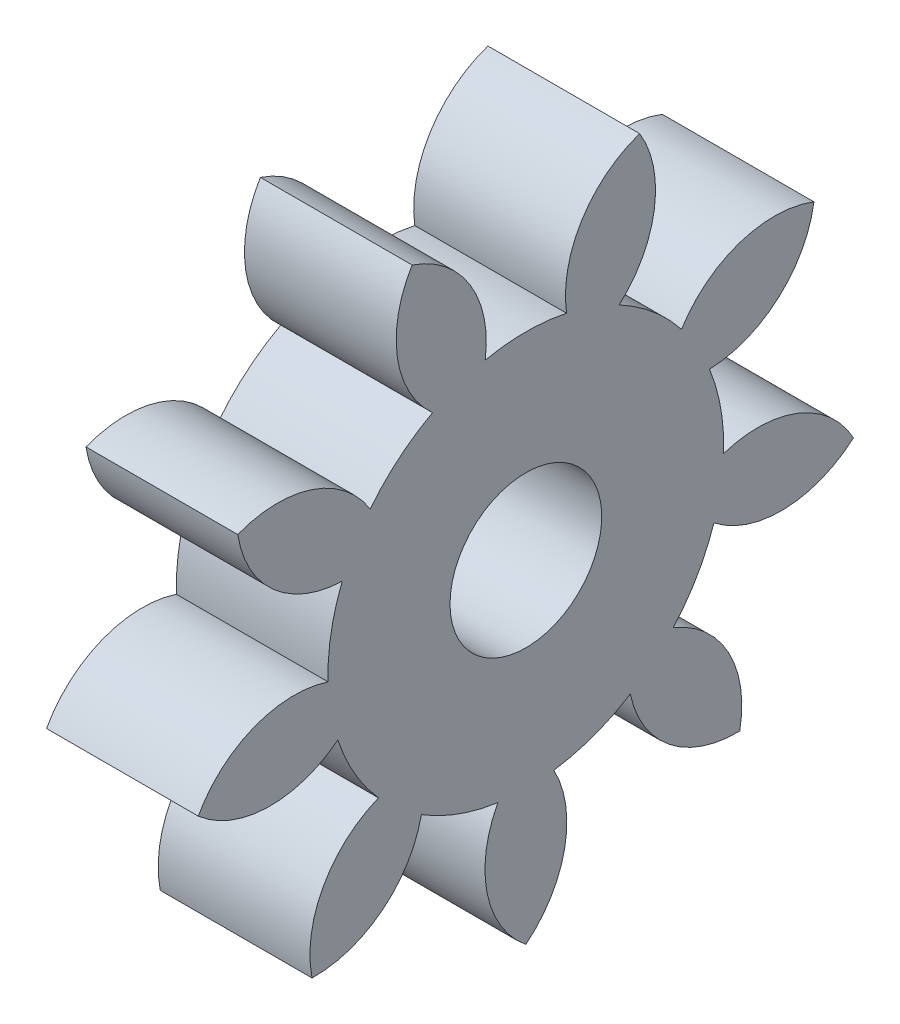
ISO-10303-21;
HEADER;
FILE_DESCRIPTION(('STEP AP214'),'2;1');
FILE_NAME('part.step','',(''),(''),'','','');
FILE_SCHEMA(('AUTOMOTIVE_DESIGN { 1 0 10303 214 1 1 1 1 }'));
ENDSEC;
DATA;
#1=APPLICATION_CONTEXT('core data for automotive mechanical design processes');
#2=APPLICATION_PROTOCOL_DEFINITION('international standard','automotive_design',2000,#1);
#3=PRODUCT_CONTEXT('',#1,'mechanical');
#4=PRODUCT('Part','Part','',(#3));
#5=PRODUCT_RELATED_PRODUCT_CATEGORY('part','',(#4));
#6=PRODUCT_DEFINITION_FORMATION('','',#4);
#7=PRODUCT_DEFINITION_CONTEXT('part definition',#1,'design');
#8=PRODUCT_DEFINITION('design','',#6,#7);
#9=PRODUCT_DEFINITION_SHAPE('','',#8);
#10=(LENGTH_UNIT() NAMED_UNIT(*) SI_UNIT(.MILLI.,.METRE.));
#11=(NAMED_UNIT(*) PLANE_ANGLE_UNIT() SI_UNIT($,.RADIAN.));
#12=(NAMED_UNIT(*) SI_UNIT($,.STERADIAN.) SOLID_ANGLE_UNIT());
#13=UNCERTAINTY_MEASURE_WITH_UNIT(LENGTH_MEASURE(1.E-05),#10,'distance_accuracy_value','');
#14=(GEOMETRIC_REPRESENTATION_CONTEXT(3) GLOBAL_UNCERTAINTY_ASSIGNED_CONTEXT((#13)) GLOBAL_UNIT_ASSIGNED_CONTEXT((#10,
#11,#12)) REPRESENTATION_CONTEXT('',''));
#15=CARTESIAN_POINT('',(0.,0.,0.));
#16=DIRECTION('',(0.,0.,1.));
#17=DIRECTION('',(1.,0.,0.));
#18=AXIS2_PLACEMENT_3D('',#15,#16,#17);
#19=CARTESIAN_POINT('',(3.175,0.,0.));
#20=DIRECTION('',(-1.,0.,0.));
#21=DIRECTION('',(0.,0.,1.));
#22=AXIS2_PLACEMENT_3D('',#19,#20,#21);
#23=PLANE('',#22);
#24=CARTESIAN_POINT('',(3.175,5.35333295209364,0.427099251646094));
#25=DIRECTION('',(-1.,0.,0.));
#26=DIRECTION('',(0.,0.642787609686541,-0.766044443118977));
#27=AXIS2_PLACEMENT_3D('',#24,#25,#26);
#28=CIRCLE('',#27,2.286);
#29=CARTESIAN_POINT('',(3.175,3.65082029361267,1.95263084676698));
#30=VERTEX_POINT('',#29);
#31=CARTESIAN_POINT('',(3.175,6.54062407727787,2.380592477654));
#32=VERTEX_POINT('',#31);
#33=EDGE_CURVE('E50',#30,#32,#28,.T.);
#34=ORIENTED_EDGE('',*,*,#33,.F.);
#35=CARTESIAN_POINT('',(3.175,0.,0.));
#36=DIRECTION('',(-1.,0.,0.));
#37=DIRECTION('',(0.,0.642787609686541,-0.766044443118977));
#38=AXIS2_PLACEMENT_3D('',#35,#36,#37);
#39=CIRCLE('',#38,4.1402);
#40=CARTESIAN_POINT('',(3.175,2.55692428764219,3.25628534180675));
#41=VERTEX_POINT('',#40);
#42=EDGE_CURVE('E273',#41,#30,#39,.T.);
#43=ORIENTED_EDGE('',*,*,#42,.F.);
#44=CARTESIAN_POINT('',(3.175,1.35020716590216,5.19783878894629));
#45=DIRECTION('',(-1.,0.,0.));
#46=DIRECTION('',(0.,0.642787609686541,-0.766044443118977));
#47=AXIS2_PLACEMENT_3D('',#44,#45,#46);
#48=CIRCLE('',#47,2.286);
#49=CARTESIAN_POINT('',(3.175,3.48019338057993,6.02787175532935));
#50=VERTEX_POINT('',#49);
#51=EDGE_CURVE('E429',#50,#41,#48,.T.);
#52=ORIENTED_EDGE('',*,*,#51,.F.);
#53=CARTESIAN_POINT('',(3.175,3.82635685305253,3.76823310051622));
#54=DIRECTION('',(-1.,0.,0.));
#55=DIRECTION('',(0.,0.984807753012209,-0.173648177666927));
#56=AXIS2_PLACEMENT_3D('',#53,#54,#55);
#57=CIRCLE('',#56,2.286);
#58=CARTESIAN_POINT('',(3.175,1.54156368415443,3.84250405955495));
#59=VERTEX_POINT('',#58);
#60=EDGE_CURVE('E409',#59,#50,#57,.T.);
#61=ORIENTED_EDGE('',*,*,#60,.F.);
#62=CARTESIAN_POINT('',(3.175,0.,0.));
#63=DIRECTION('',(-1.,0.,0.));
#64=DIRECTION('',(0.,0.984807753012209,-0.173648177666927));
#65=AXIS2_PLACEMENT_3D('',#62,#63,#64);
#66=CIRCLE('',#65,4.1402);
#67=CARTESIAN_POINT('',(3.175,-0.13438222929303,4.13801854230382));
#68=VERTEX_POINT('',#67);
#69=EDGE_CURVE('E415',#68,#59,#66,.T.);
#70=ORIENTED_EDGE('',*,*,#69,.F.);
#71=CARTESIAN_POINT('',(3.175,-2.306787674184,4.84967195725247));
#72=DIRECTION('',(-1.,0.,0.));
#73=DIRECTION('',(0.,0.984807753012209,-0.173648177666927));
#74=AXIS2_PLACEMENT_3D('',#71,#72,#73);
#75=CIRCLE('',#74,2.286);
#76=CARTESIAN_POINT('',(3.175,-1.20865847693247,6.85464284635378));
#77=VERTEX_POINT('',#76);
#78=EDGE_CURVE('E412',#77,#68,#75,.T.);
#79=ORIENTED_EDGE('',*,*,#78,.F.);
#80=CARTESIAN_POINT('',(3.175,0.508985857248586,5.3461688024088));
#81=DIRECTION('',(-1.,0.,0.));
#82=DIRECTION('',(0.,0.866025403784436,0.500000000000004));
#83=AXIS2_PLACEMENT_3D('',#80,#81,#82);
#84=CIRCLE('',#83,2.286);
#85=CARTESIAN_POINT('',(3.175,-1.28900770569164,3.93442691820138));
#86=VERTEX_POINT('',#85);
#87=EDGE_CURVE('E387',#86,#77,#84,.T.);
#88=ORIENTED_EDGE('',*,*,#87,.F.);
#89=CARTESIAN_POINT('',(3.175,0.,0.));
#90=DIRECTION('',(-1.,0.,0.));
#91=DIRECTION('',(0.,0.866025403784436,0.500000000000004));
#92=AXIS2_PLACEMENT_3D('',#89,#90,#91);
#93=CIRCLE('',#92,4.1402);
#94=CARTESIAN_POINT('',(3.175,-2.76280980764992,3.08352687790352));
#95=VERTEX_POINT('',#94);
#96=EDGE_CURVE('E393',#95,#86,#93,.T.);
#97=ORIENTED_EDGE('',*,*,#96,.F.);
#98=CARTESIAN_POINT('',(3.175,-4.88441092443016,2.23228971866008));
#99=DIRECTION('',(-1.,0.,0.));
#100=DIRECTION('',(0.,0.866025403784436,0.500000000000004));
#101=AXIS2_PLACEMENT_3D('',#98,#99,#100);
#102=CIRCLE('',#101,2.286);
#103=CARTESIAN_POINT('',(3.175,-5.33196560034545,4.47405036869977));
#104=VERTEX_POINT('',#103);
#105=EDGE_CURVE('E390',#104,#95,#102,.T.);
#106=ORIENTED_EDGE('',*,*,#105,.F.);
#107=CARTESIAN_POINT('',(3.175,-3.04654527790968,4.42257270560637));
#108=DIRECTION('',(-1.,0.,0.));
#109=DIRECTION('',(0.,0.342020143325663,0.939692620785911));
#110=AXIS2_PLACEMENT_3D('',#107,#108,#109);
#111=CIRCLE('',#110,2.286);
#112=CARTESIAN_POINT('',(3.175,-3.51643806431967,2.18538769553683));
#113=VERTEX_POINT('',#112);
#114=EDGE_CURVE('E365',#113,#104,#111,.T.);
#115=ORIENTED_EDGE('',*,*,#114,.F.);
#116=CARTESIAN_POINT('',(3.175,0.,0.));
#117=DIRECTION('',(-1.,0.,0.));
#118=DIRECTION('',(0.,0.342020143325663,0.939692620785911));
#119=AXIS2_PLACEMENT_3D('',#116,#117,#118);
#120=CIRCLE('',#119,4.1402);
#121=CARTESIAN_POINT('',(3.175,-4.09848797179663,0.586218717748173));
#122=VERTEX_POINT('',#121);
#123=EDGE_CURVE('E371',#122,#113,#120,.T.);
#124=ORIENTED_EDGE('',*,*,#123,.F.);
#125=CARTESIAN_POINT('',(3.175,-5.1765640189547,-1.42960568843011));
#126=DIRECTION('',(-1.,0.,0.));
#127=DIRECTION('',(0.,0.342020143325663,0.939692620785911));
#128=AXIS2_PLACEMENT_3D('',#125,#126,#127);
#129=CIRCLE('',#128,2.286);
#130=CARTESIAN_POINT('',(3.175,-6.96038676115988,0.));
#131=VERTEX_POINT('',#130);
#132=EDGE_CURVE('E368',#131,#122,#129,.T.);
#133=ORIENTED_EDGE('',*,*,#132,.F.);
#134=CARTESIAN_POINT('',(3.175,-5.17656401895472,1.42960568843004));
#135=DIRECTION('',(-1.,0.,0.));
#136=DIRECTION('',(0.,-0.342020143325676,0.939692620785906));
#137=AXIS2_PLACEMENT_3D('',#134,#135,#136);
#138=CIRCLE('',#137,2.286);
#139=CARTESIAN_POINT('',(3.175,-4.09848797179663,-0.586218717748228));
#140=VERTEX_POINT('',#139);
#141=EDGE_CURVE('E343',#140,#131,#138,.T.);
#142=ORIENTED_EDGE('',*,*,#141,.F.);
#143=CARTESIAN_POINT('',(3.175,0.,0.));
#144=DIRECTION('',(-1.,0.,0.));
#145=DIRECTION('',(0.,-0.342020143325676,0.939692620785906));
#146=AXIS2_PLACEMENT_3D('',#143,#144,#145);
#147=CIRCLE('',#146,4.1402);
#148=CARTESIAN_POINT('',(3.175,-3.51643806431964,-2.18538769553688));
#149=VERTEX_POINT('',#148);
#150=EDGE_CURVE('E349',#149,#140,#147,.T.);
#151=ORIENTED_EDGE('',*,*,#150,.F.);
#152=CARTESIAN_POINT('',(3.175,-3.04654527790962,-4.42257270560641));
#153=DIRECTION('',(-1.,0.,0.));
#154=DIRECTION('',(0.,-0.342020143325676,0.939692620785906));
#155=AXIS2_PLACEMENT_3D('',#152,#153,#154);
#156=CIRCLE('',#155,2.286);
#157=CARTESIAN_POINT('',(3.175,-5.33196560034539,-4.47405036869984));
#158=VERTEX_POINT('',#157);
#159=EDGE_CURVE('E346',#158,#149,#156,.T.);
#160=ORIENTED_EDGE('',*,*,#159,.F.);
#161=CARTESIAN_POINT('',(3.175,-4.88441092443013,-2.23228971866015));
#162=DIRECTION('',(-1.,0.,0.));
#163=DIRECTION('',(0.,-0.866025403784443,0.499999999999992));
#164=AXIS2_PLACEMENT_3D('',#161,#162,#163);
#165=CIRCLE('',#164,2.286);
#166=CARTESIAN_POINT('',(3.175,-2.76280980764988,-3.08352687790355));
#167=VERTEX_POINT('',#166);
#168=EDGE_CURVE('E321',#167,#158,#165,.T.);
#169=ORIENTED_EDGE('',*,*,#168,.F.);
#170=CARTESIAN_POINT('',(3.175,0.,0.));
#171=DIRECTION('',(-1.,0.,0.));
#172=DIRECTION('',(0.,-0.866025403784443,0.499999999999992));
#173=AXIS2_PLACEMENT_3D('',#170,#171,#172);
#174=CIRCLE('',#173,4.1402);
#175=CARTESIAN_POINT('',(3.175,-1.28900770569158,-3.93442691820139));
#176=VERTEX_POINT('',#175);
#177=EDGE_CURVE('E327',#176,#167,#174,.T.);
#178=ORIENTED_EDGE('',*,*,#177,.F.);
#179=CARTESIAN_POINT('',(3.175,0.508985857248661,-5.34616880240879));
#180=DIRECTION('',(-1.,0.,0.));
#181=DIRECTION('',(0.,-0.866025403784443,0.499999999999992));
#182=AXIS2_PLACEMENT_3D('',#179,#180,#181);
#183=CIRCLE('',#182,2.286);
#184=CARTESIAN_POINT('',(3.175,-1.20865847693237,-6.85464284635379));
#185=VERTEX_POINT('',#184);
#186=EDGE_CURVE('E324',#185,#176,#183,.T.);
#187=ORIENTED_EDGE('',*,*,#186,.F.);
#188=CARTESIAN_POINT('',(3.175,-2.30678767418394,-4.8496719572525));
#189=DIRECTION('',(-1.,0.,0.));
#190=DIRECTION('',(0.,-0.984807753012206,-0.17364817766694));
#191=AXIS2_PLACEMENT_3D('',#188,#189,#190);
#192=CIRCLE('',#191,2.286);
#193=CARTESIAN_POINT('',(3.175,-0.134382229292976,-4.13801854230382));
#194=VERTEX_POINT('',#193);
#195=EDGE_CURVE('E299',#194,#185,#192,.T.);
#196=ORIENTED_EDGE('',*,*,#195,.F.);
#197=CARTESIAN_POINT('',(3.175,0.,0.));
#198=DIRECTION('',(-1.,0.,0.));
#199=DIRECTION('',(0.,-0.984807753012206,-0.17364817766694));
#200=AXIS2_PLACEMENT_3D('',#197,#198,#199);
#201=CIRCLE('',#200,4.1402);
#202=CARTESIAN_POINT('',(3.175,1.54156368415448,-3.84250405955492));
#203=VERTEX_POINT('',#202);
#204=EDGE_CURVE('E305',#203,#194,#201,.T.);
#205=ORIENTED_EDGE('',*,*,#204,.F.);
#206=CARTESIAN_POINT('',(3.175,3.82635685305259,-3.76823310051617));
#207=DIRECTION('',(-1.,0.,0.));
#208=DIRECTION('',(0.,-0.984807753012206,-0.17364817766694));
#209=AXIS2_PLACEMENT_3D('',#206,#207,#208);
#210=CIRCLE('',#209,2.286);
#211=CARTESIAN_POINT('',(3.175,3.48019338058001,-6.02787175532931));
#212=VERTEX_POINT('',#211);
#213=EDGE_CURVE('E302',#212,#203,#210,.T.);
#214=ORIENTED_EDGE('',*,*,#213,.F.);
#215=CARTESIAN_POINT('',(3.175,1.35020716590223,-5.19783878894628));
#216=DIRECTION('',(-1.,0.,0.));
#217=DIRECTION('',(0.,-0.64278760968653,-0.766044443118986));
#218=AXIS2_PLACEMENT_3D('',#215,#216,#217);
#219=CIRCLE('',#218,2.286);
#220=CARTESIAN_POINT('',(3.175,2.55692428764223,-3.25628534180671));
#221=VERTEX_POINT('',#220);
#222=EDGE_CURVE('E284',#221,#212,#219,.T.);
#223=ORIENTED_EDGE('',*,*,#222,.F.);
#224=CARTESIAN_POINT('',(3.175,0.,0.));
#225=DIRECTION('',(-1.,0.,0.));
#226=DIRECTION('',(0.,-0.64278760968653,-0.766044443118986));
#227=AXIS2_PLACEMENT_3D('',#224,#225,#226);
#228=CIRCLE('',#227,4.1402);
#229=CARTESIAN_POINT('',(3.175,3.65082029361269,-1.95263084676693));
#230=VERTEX_POINT('',#229);
#231=EDGE_CURVE('E283',#230,#221,#228,.T.);
#232=ORIENTED_EDGE('',*,*,#231,.F.);
#233=CARTESIAN_POINT('',(3.175,5.35333295209364,-0.427099251646021));
#234=DIRECTION('',(-1.,0.,0.));
#235=DIRECTION('',(0.,-0.64278760968653,-0.766044443118986));
#236=AXIS2_PLACEMENT_3D('',#233,#234,#235);
#237=CIRCLE('',#236,2.286);
#238=CARTESIAN_POINT('',(3.175,6.54062407727785,-2.38059247765394));
#239=VERTEX_POINT('',#238);
#240=EDGE_CURVE('E281',#239,#230,#237,.T.);
#241=ORIENTED_EDGE('',*,*,#240,.F.);
#242=CARTESIAN_POINT('',(3.175,4.37542506718154,-3.11387908374869));
#243=DIRECTION('',(-1.,0.,0.));
#244=DIRECTION('',(0.,0.,-1.));
#245=AXIS2_PLACEMENT_3D('',#242,#243,#244);
#246=CIRCLE('',#245,2.286);
#247=CARTESIAN_POINT('',(3.175,4.05181751334153,-0.850900040297855));
#248=VERTEX_POINT('',#247);
#249=EDGE_CURVE('E231',#248,#239,#246,.T.);
#250=ORIENTED_EDGE('',*,*,#249,.F.);
#251=CARTESIAN_POINT('',(3.175,0.,0.));
#252=DIRECTION('',(-1.,0.,0.));
#253=DIRECTION('',(0.,0.,-1.));
#254=AXIS2_PLACEMENT_3D('',#251,#252,#253);
#255=CIRCLE('',#254,4.1402);
#256=CARTESIAN_POINT('',(3.175,4.05181751334153,0.850900040297854));
#257=VERTEX_POINT('',#256);
#258=EDGE_CURVE('E247',#257,#248,#255,.T.);
#259=ORIENTED_EDGE('',*,*,#258,.F.);
#260=CARTESIAN_POINT('',(3.175,4.37542506718154,3.11387908374869));
#261=DIRECTION('',(-1.,0.,0.));
#262=DIRECTION('',(0.,0.,-1.));
#263=AXIS2_PLACEMENT_3D('',#260,#261,#262);
#264=CIRCLE('',#263,2.286);
#265=EDGE_CURVE('E256',#32,#257,#264,.T.);
#266=ORIENTED_EDGE('',*,*,#265,.F.);
#267=EDGE_LOOP('',(#34,#43,#52,#61,#70,#79,#88,#97,#106,#115,#124,#133,#142,#151,#160,#169,#178,
#187,#196,#205,#214,#223,#232,#241,#250,#259,#266));
#268=FACE_BOUND('',#267,.T.);
#269=CARTESIAN_POINT('',(3.175,0.,0.));
#270=DIRECTION('',(-1.,0.,0.));
#271=DIRECTION('',(0.,0.,1.));
#272=AXIS2_PLACEMENT_3D('',#269,#270,#271);
#273=CIRCLE('',#272,1.5875);
#274=CARTESIAN_POINT('',(3.175,0.,1.5875));
#275=VERTEX_POINT('',#274);
#276=EDGE_CURVE('E232',#275,#275,#273,.F.);
#277=ORIENTED_EDGE('',*,*,#276,.F.);
#278=EDGE_LOOP('',(#277));
#279=FACE_BOUND('',#278,.T.);
#280=ADVANCED_FACE('F35',(#268,#279),#23,.F.);
#281=CARTESIAN_POINT('',(0.,0.,0.));
#282=DIRECTION('',(1.,0.,0.));
#283=DIRECTION('',(0.,0.,-1.));
#284=AXIS2_PLACEMENT_3D('',#281,#282,#283);
#285=PLANE('',#284);
#286=CARTESIAN_POINT('',(0.,5.35333295209364,0.427099251646094));
#287=DIRECTION('',(-1.,0.,0.));
#288=DIRECTION('',(0.,0.642787609686541,-0.766044443118977));
#289=AXIS2_PLACEMENT_3D('',#286,#287,#288);
#290=CIRCLE('',#289,2.286);
#291=CARTESIAN_POINT('',(0.,3.65082029361267,1.95263084676698));
#292=VERTEX_POINT('',#291);
#293=CARTESIAN_POINT('',(0.,6.54062407727787,2.380592477654));
#294=VERTEX_POINT('',#293);
#295=EDGE_CURVE('E262',#292,#294,#290,.T.);
#296=ORIENTED_EDGE('',*,*,#295,.T.);
#297=CARTESIAN_POINT('',(0.,4.37542506718154,3.11387908374869));
#298=DIRECTION('',(1.,0.,0.));
#299=DIRECTION('',(0.,0.,-1.));
#300=AXIS2_PLACEMENT_3D('',#297,#298,#299);
#301=CIRCLE('',#300,2.286);
#302=CARTESIAN_POINT('',(0.,4.05181751334153,0.850900040297854));
#303=VERTEX_POINT('',#302);
#304=EDGE_CURVE('E11',#303,#294,#301,.T.);
#305=ORIENTED_EDGE('',*,*,#304,.F.);
#306=CARTESIAN_POINT('',(0.,0.,0.));
#307=DIRECTION('',(-1.,0.,0.));
#308=DIRECTION('',(0.,0.,-1.));
#309=AXIS2_PLACEMENT_3D('',#306,#307,#308);
#310=CIRCLE('',#309,4.1402);
#311=CARTESIAN_POINT('',(0.,4.05181751334153,-0.850900040297855));
#312=VERTEX_POINT('',#311);
#313=EDGE_CURVE('E240',#303,#312,#310,.T.);
#314=ORIENTED_EDGE('',*,*,#313,.T.);
#315=CARTESIAN_POINT('',(0.,4.37542506718154,-3.11387908374869));
#316=DIRECTION('',(-1.,0.,0.));
#317=DIRECTION('',(0.,0.,-1.));
#318=AXIS2_PLACEMENT_3D('',#315,#316,#317);
#319=CIRCLE('',#318,2.286);
#320=CARTESIAN_POINT('',(0.,6.54062407727785,-2.38059247765394));
#321=VERTEX_POINT('',#320);
#322=EDGE_CURVE('E58',#312,#321,#319,.T.);
#323=ORIENTED_EDGE('',*,*,#322,.T.);
#324=CARTESIAN_POINT('',(0.,5.35333295209364,-0.427099251646021));
#325=DIRECTION('',(-1.,0.,0.));
#326=DIRECTION('',(0.,-0.64278760968653,-0.766044443118986));
#327=AXIS2_PLACEMENT_3D('',#324,#325,#326);
#328=CIRCLE('',#327,2.286);
#329=CARTESIAN_POINT('',(0.,3.65082029361269,-1.95263084676693));
#330=VERTEX_POINT('',#329);
#331=EDGE_CURVE('E216',#321,#330,#328,.T.);
#332=ORIENTED_EDGE('',*,*,#331,.T.);
#333=CARTESIAN_POINT('',(0.,0.,0.));
#334=DIRECTION('',(-1.,0.,0.));
#335=DIRECTION('',(0.,-0.64278760968653,-0.766044443118986));
#336=AXIS2_PLACEMENT_3D('',#333,#334,#335);
#337=CIRCLE('',#336,4.1402);
#338=CARTESIAN_POINT('',(0.,2.55692428764223,-3.25628534180671));
#339=VERTEX_POINT('',#338);
#340=EDGE_CURVE('E225',#330,#339,#337,.T.);
#341=ORIENTED_EDGE('',*,*,#340,.T.);
#342=CARTESIAN_POINT('',(0.,1.35020716590223,-5.19783878894628));
#343=DIRECTION('',(-1.,0.,0.));
#344=DIRECTION('',(0.,-0.64278760968653,-0.766044443118986));
#345=AXIS2_PLACEMENT_3D('',#342,#343,#344);
#346=CIRCLE('',#345,2.286);
#347=CARTESIAN_POINT('',(0.,3.48019338058001,-6.02787175532931));
#348=VERTEX_POINT('',#347);
#349=EDGE_CURVE('E226',#339,#348,#346,.T.);
#350=ORIENTED_EDGE('',*,*,#349,.T.);
#351=CARTESIAN_POINT('',(0.,3.82635685305259,-3.76823310051617));
#352=DIRECTION('',(-1.,0.,0.));
#353=DIRECTION('',(0.,-0.984807753012206,-0.17364817766694));
#354=AXIS2_PLACEMENT_3D('',#351,#352,#353);
#355=CIRCLE('',#354,2.286);
#356=CARTESIAN_POINT('',(0.,1.54156368415448,-3.84250405955492));
#357=VERTEX_POINT('',#356);
#358=EDGE_CURVE('E310',#348,#357,#355,.T.);
#359=ORIENTED_EDGE('',*,*,#358,.T.);
#360=CARTESIAN_POINT('',(0.,0.,0.));
#361=DIRECTION('',(-1.,0.,0.));
#362=DIRECTION('',(0.,-0.984807753012206,-0.17364817766694));
#363=AXIS2_PLACEMENT_3D('',#360,#361,#362);
#364=CIRCLE('',#363,4.1402);
#365=CARTESIAN_POINT('',(0.,-0.134382229292976,-4.13801854230382));
#366=VERTEX_POINT('',#365);
#367=EDGE_CURVE('E303',#357,#366,#364,.T.);
#368=ORIENTED_EDGE('',*,*,#367,.T.);
#369=CARTESIAN_POINT('',(0.,-2.30678767418394,-4.8496719572525));
#370=DIRECTION('',(-1.,0.,0.));
#371=DIRECTION('',(0.,-0.984807753012206,-0.17364817766694));
#372=AXIS2_PLACEMENT_3D('',#369,#370,#371);
#373=CIRCLE('',#372,2.286);
#374=CARTESIAN_POINT('',(0.,-1.20865847693237,-6.85464284635379));
#375=VERTEX_POINT('',#374);
#376=EDGE_CURVE('E298',#366,#375,#373,.T.);
#377=ORIENTED_EDGE('',*,*,#376,.T.);
#378=CARTESIAN_POINT('',(0.,0.508985857248661,-5.34616880240879));
#379=DIRECTION('',(-1.,0.,0.));
#380=DIRECTION('',(0.,-0.866025403784443,0.499999999999992));
#381=AXIS2_PLACEMENT_3D('',#378,#379,#380);
#382=CIRCLE('',#381,2.286);
#383=CARTESIAN_POINT('',(0.,-1.28900770569158,-3.93442691820139));
#384=VERTEX_POINT('',#383);
#385=EDGE_CURVE('E332',#375,#384,#382,.T.);
#386=ORIENTED_EDGE('',*,*,#385,.T.);
#387=CARTESIAN_POINT('',(0.,0.,0.));
#388=DIRECTION('',(-1.,0.,0.));
#389=DIRECTION('',(0.,-0.866025403784443,0.499999999999992));
#390=AXIS2_PLACEMENT_3D('',#387,#388,#389);
#391=CIRCLE('',#390,4.1402);
#392=CARTESIAN_POINT('',(0.,-2.76280980764988,-3.08352687790355));
#393=VERTEX_POINT('',#392);
#394=EDGE_CURVE('E325',#384,#393,#391,.T.);
#395=ORIENTED_EDGE('',*,*,#394,.T.);
#396=CARTESIAN_POINT('',(0.,-4.88441092443013,-2.23228971866015));
#397=DIRECTION('',(-1.,0.,0.));
#398=DIRECTION('',(0.,-0.866025403784443,0.499999999999992));
#399=AXIS2_PLACEMENT_3D('',#396,#397,#398);
#400=CIRCLE('',#399,2.286);
#401=CARTESIAN_POINT('',(0.,-5.33196560034539,-4.47405036869984));
#402=VERTEX_POINT('',#401);
#403=EDGE_CURVE('E320',#393,#402,#400,.T.);
#404=ORIENTED_EDGE('',*,*,#403,.T.);
#405=CARTESIAN_POINT('',(0.,-3.04654527790962,-4.42257270560641));
#406=DIRECTION('',(-1.,0.,0.));
#407=DIRECTION('',(0.,-0.342020143325676,0.939692620785906));
#408=AXIS2_PLACEMENT_3D('',#405,#406,#407);
#409=CIRCLE('',#408,2.286);
#410=CARTESIAN_POINT('',(0.,-3.51643806431964,-2.18538769553688));
#411=VERTEX_POINT('',#410);
#412=EDGE_CURVE('E354',#402,#411,#409,.T.);
#413=ORIENTED_EDGE('',*,*,#412,.T.);
#414=CARTESIAN_POINT('',(0.,0.,0.));
#415=DIRECTION('',(-1.,0.,0.));
#416=DIRECTION('',(0.,-0.342020143325676,0.939692620785906));
#417=AXIS2_PLACEMENT_3D('',#414,#415,#416);
#418=CIRCLE('',#417,4.1402);
#419=CARTESIAN_POINT('',(0.,-4.09848797179663,-0.586218717748228));
#420=VERTEX_POINT('',#419);
#421=EDGE_CURVE('E347',#411,#420,#418,.T.);
#422=ORIENTED_EDGE('',*,*,#421,.T.);
#423=CARTESIAN_POINT('',(0.,-5.17656401895472,1.42960568843004));
#424=DIRECTION('',(-1.,0.,0.));
#425=DIRECTION('',(0.,-0.342020143325676,0.939692620785906));
#426=AXIS2_PLACEMENT_3D('',#423,#424,#425);
#427=CIRCLE('',#426,2.286);
#428=CARTESIAN_POINT('',(0.,-6.96038676115988,0.));
#429=VERTEX_POINT('',#428);
#430=EDGE_CURVE('E342',#420,#429,#427,.T.);
#431=ORIENTED_EDGE('',*,*,#430,.T.);
#432=CARTESIAN_POINT('',(0.,-5.1765640189547,-1.42960568843011));
#433=DIRECTION('',(-1.,0.,0.));
#434=DIRECTION('',(0.,0.342020143325663,0.939692620785911));
#435=AXIS2_PLACEMENT_3D('',#432,#433,#434);
#436=CIRCLE('',#435,2.286);
#437=CARTESIAN_POINT('',(0.,-4.09848797179663,0.586218717748173));
#438=VERTEX_POINT('',#437);
#439=EDGE_CURVE('E376',#429,#438,#436,.T.);
#440=ORIENTED_EDGE('',*,*,#439,.T.);
#441=CARTESIAN_POINT('',(0.,0.,0.));
#442=DIRECTION('',(-1.,0.,0.));
#443=DIRECTION('',(0.,0.342020143325663,0.939692620785911));
#444=AXIS2_PLACEMENT_3D('',#441,#442,#443);
#445=CIRCLE('',#444,4.1402);
#446=CARTESIAN_POINT('',(0.,-3.51643806431967,2.18538769553683));
#447=VERTEX_POINT('',#446);
#448=EDGE_CURVE('E369',#438,#447,#445,.T.);
#449=ORIENTED_EDGE('',*,*,#448,.T.);
#450=CARTESIAN_POINT('',(0.,-3.04654527790968,4.42257270560637));
#451=DIRECTION('',(-1.,0.,0.));
#452=DIRECTION('',(0.,0.342020143325663,0.939692620785911));
#453=AXIS2_PLACEMENT_3D('',#450,#451,#452);
#454=CIRCLE('',#453,2.286);
#455=CARTESIAN_POINT('',(0.,-5.33196560034545,4.47405036869977));
#456=VERTEX_POINT('',#455);
#457=EDGE_CURVE('E364',#447,#456,#454,.T.);
#458=ORIENTED_EDGE('',*,*,#457,.T.);
#459=CARTESIAN_POINT('',(0.,-4.88441092443016,2.23228971866008));
#460=DIRECTION('',(-1.,0.,0.));
#461=DIRECTION('',(0.,0.866025403784436,0.500000000000004));
#462=AXIS2_PLACEMENT_3D('',#459,#460,#461);
#463=CIRCLE('',#462,2.286);
#464=CARTESIAN_POINT('',(0.,-2.76280980764992,3.08352687790352));
#465=VERTEX_POINT('',#464);
#466=EDGE_CURVE('E398',#456,#465,#463,.T.);
#467=ORIENTED_EDGE('',*,*,#466,.T.);
#468=CARTESIAN_POINT('',(0.,0.,0.));
#469=DIRECTION('',(-1.,0.,0.));
#470=DIRECTION('',(0.,0.866025403784436,0.500000000000004));
#471=AXIS2_PLACEMENT_3D('',#468,#469,#470);
#472=CIRCLE('',#471,4.1402);
#473=CARTESIAN_POINT('',(0.,-1.28900770569164,3.93442691820138));
#474=VERTEX_POINT('',#473);
#475=EDGE_CURVE('E391',#465,#474,#472,.T.);
#476=ORIENTED_EDGE('',*,*,#475,.T.);
#477=CARTESIAN_POINT('',(0.,0.508985857248586,5.3461688024088));
#478=DIRECTION('',(-1.,0.,0.));
#479=DIRECTION('',(0.,0.866025403784436,0.500000000000004));
#480=AXIS2_PLACEMENT_3D('',#477,#478,#479);
#481=CIRCLE('',#480,2.286);
#482=CARTESIAN_POINT('',(0.,-1.20865847693247,6.85464284635378));
#483=VERTEX_POINT('',#482);
#484=EDGE_CURVE('E386',#474,#483,#481,.T.);
#485=ORIENTED_EDGE('',*,*,#484,.T.);
#486=CARTESIAN_POINT('',(0.,-2.306787674184,4.84967195725247));
#487=DIRECTION('',(-1.,0.,0.));
#488=DIRECTION('',(0.,0.984807753012209,-0.173648177666927));
#489=AXIS2_PLACEMENT_3D('',#486,#487,#488);
#490=CIRCLE('',#489,2.286);
#491=CARTESIAN_POINT('',(0.,-0.13438222929303,4.13801854230382));
#492=VERTEX_POINT('',#491);
#493=EDGE_CURVE('E420',#483,#492,#490,.T.);
#494=ORIENTED_EDGE('',*,*,#493,.T.);
#495=CARTESIAN_POINT('',(0.,0.,0.));
#496=DIRECTION('',(-1.,0.,0.));
#497=DIRECTION('',(0.,0.984807753012209,-0.173648177666927));
#498=AXIS2_PLACEMENT_3D('',#495,#496,#497);
#499=CIRCLE('',#498,4.1402);
#500=CARTESIAN_POINT('',(0.,1.54156368415443,3.84250405955495));
#501=VERTEX_POINT('',#500);
#502=EDGE_CURVE('E413',#492,#501,#499,.T.);
#503=ORIENTED_EDGE('',*,*,#502,.T.);
#504=CARTESIAN_POINT('',(0.,3.82635685305253,3.76823310051622));
#505=DIRECTION('',(-1.,0.,0.));
#506=DIRECTION('',(0.,0.984807753012209,-0.173648177666927));
#507=AXIS2_PLACEMENT_3D('',#504,#505,#506);
#508=CIRCLE('',#507,2.286);
#509=CARTESIAN_POINT('',(0.,3.48019338057993,6.02787175532936));
#510=VERTEX_POINT('',#509);
#511=EDGE_CURVE('E408',#501,#510,#508,.T.);
#512=ORIENTED_EDGE('',*,*,#511,.T.);
#513=CARTESIAN_POINT('',(0.,1.35020716590216,5.19783878894629));
#514=DIRECTION('',(-1.,0.,0.));
#515=DIRECTION('',(0.,0.642787609686541,-0.766044443118977));
#516=AXIS2_PLACEMENT_3D('',#513,#514,#515);
#517=CIRCLE('',#516,2.286);
#518=CARTESIAN_POINT('',(0.,2.55692428764219,3.25628534180675));
#519=VERTEX_POINT('',#518);
#520=EDGE_CURVE('E266',#510,#519,#517,.T.);
#521=ORIENTED_EDGE('',*,*,#520,.T.);
#522=CARTESIAN_POINT('',(0.,0.,0.));
#523=DIRECTION('',(-1.,0.,0.));
#524=DIRECTION('',(0.,0.642787609686541,-0.766044443118977));
#525=AXIS2_PLACEMENT_3D('',#522,#523,#524);
#526=CIRCLE('',#525,4.1402);
#527=EDGE_CURVE('E265',#519,#292,#526,.T.);
#528=ORIENTED_EDGE('',*,*,#527,.T.);
#529=EDGE_LOOP('',(#296,#305,#314,#323,#332,#341,#350,#359,#368,#377,#386,#395,#404,#413,#422,
#431,#440,#449,#458,#467,#476,#485,#494,#503,#512,#521,#528));
#530=FACE_BOUND('',#529,.T.);
#531=CARTESIAN_POINT('',(0.,0.,0.));
#532=DIRECTION('',(1.,0.,0.));
#533=DIRECTION('',(0.,0.,-1.));
#534=AXIS2_PLACEMENT_3D('',#531,#532,#533);
#535=CIRCLE('',#534,1.5875);
#536=CARTESIAN_POINT('',(0.,0.,-1.5875));
#537=VERTEX_POINT('',#536);
#538=EDGE_CURVE('E38',#537,#537,#535,.F.);
#539=ORIENTED_EDGE('',*,*,#538,.F.);
#540=EDGE_LOOP('',(#539));
#541=FACE_BOUND('',#540,.T.);
#542=ADVANCED_FACE('F236',(#530,#541),#285,.F.);
#543=CARTESIAN_POINT('',(3.175,4.37542506718154,-3.11387908374869));
#544=DIRECTION('',(-1.,0.,0.));
#545=DIRECTION('',(0.,0.,1.));
#546=AXIS2_PLACEMENT_3D('',#543,#544,#545);
#547=CYLINDRICAL_SURFACE('',#546,2.286);
#548=ORIENTED_EDGE('',*,*,#249,.T.);
#549=DIRECTION('',(-1.,0.,0.));
#550=VECTOR('',#549,1.);
#551=CARTESIAN_POINT('',(1.5875,6.54062407727785,-2.38059247765394));
#552=LINE('',#551,#550);
#553=EDGE_CURVE('E218',#321,#239,#552,.F.);
#554=ORIENTED_EDGE('',*,*,#553,.F.);
#555=ORIENTED_EDGE('',*,*,#322,.F.);
#556=DIRECTION('',(-1.,0.,0.));
#557=VECTOR('',#556,1.);
#558=CARTESIAN_POINT('',(3.175,4.05181751334153,-0.850900040297855));
#559=LINE('',#558,#557);
#560=EDGE_CURVE('E250',#248,#312,#559,.T.);
#561=ORIENTED_EDGE('',*,*,#560,.F.);
#562=EDGE_LOOP('',(#548,#554,#555,#561));
#563=FACE_BOUND('',#562,.T.);
#564=ADVANCED_FACE('F229',(#563),#547,.T.);
#565=CARTESIAN_POINT('',(3.175,4.37542506718154,3.11387908374869));
#566=DIRECTION('',(-1.,0.,0.));
#567=DIRECTION('',(0.,0.,1.));
#568=AXIS2_PLACEMENT_3D('',#565,#566,#567);
#569=CYLINDRICAL_SURFACE('',#568,2.286);
#570=ORIENTED_EDGE('',*,*,#304,.T.);
#571=DIRECTION('',(-1.,0.,0.));
#572=VECTOR('',#571,1.);
#573=CARTESIAN_POINT('',(1.5875,6.54062407727787,2.380592477654));
#574=LINE('',#573,#572);
#575=EDGE_CURVE('E270',#32,#294,#574,.T.);
#576=ORIENTED_EDGE('',*,*,#575,.F.);
#577=ORIENTED_EDGE('',*,*,#265,.T.);
#578=DIRECTION('',(-1.,0.,0.));
#579=VECTOR('',#578,1.);
#580=CARTESIAN_POINT('',(3.175,4.05181751334153,0.850900040297854));
#581=LINE('',#580,#579);
#582=EDGE_CURVE('E43',#257,#303,#581,.T.);
#583=ORIENTED_EDGE('',*,*,#582,.T.);
#584=EDGE_LOOP('',(#570,#576,#577,#583));
#585=FACE_BOUND('',#584,.T.);
#586=ADVANCED_FACE('F254',(#585),#569,.T.);
#587=CARTESIAN_POINT('',(3.175,0.,0.));
#588=DIRECTION('',(-1.,0.,0.));
#589=DIRECTION('',(0.,0.,1.));
#590=AXIS2_PLACEMENT_3D('',#587,#588,#589);
#591=CYLINDRICAL_SURFACE('',#590,4.1402);
#592=ORIENTED_EDGE('',*,*,#313,.F.);
#593=ORIENTED_EDGE('',*,*,#582,.F.);
#594=ORIENTED_EDGE('',*,*,#258,.T.);
#595=ORIENTED_EDGE('',*,*,#560,.T.);
#596=EDGE_LOOP('',(#592,#593,#594,#595));
#597=FACE_BOUND('',#596,.T.);
#598=ADVANCED_FACE('F259',(#597),#591,.T.);
#599=CARTESIAN_POINT('',(3.175,5.35333295209364,0.427099251646094));
#600=DIRECTION('',(-1.,0.,0.));
#601=DIRECTION('',(0.,0.,1.));
#602=AXIS2_PLACEMENT_3D('',#599,#600,#601);
#603=CYLINDRICAL_SURFACE('',#602,2.286);
#604=ORIENTED_EDGE('',*,*,#575,.T.);
#605=ORIENTED_EDGE('',*,*,#295,.F.);
#606=DIRECTION('',(-1.,0.,0.));
#607=VECTOR('',#606,1.);
#608=CARTESIAN_POINT('',(3.175,3.65082029361267,1.95263084676698));
#609=LINE('',#608,#607);
#610=EDGE_CURVE('E244',#30,#292,#609,.T.);
#611=ORIENTED_EDGE('',*,*,#610,.F.);
#612=ORIENTED_EDGE('',*,*,#33,.T.);
#613=EDGE_LOOP('',(#604,#605,#611,#612));
#614=FACE_BOUND('',#613,.T.);
#615=ADVANCED_FACE('F436',(#614),#603,.T.);
#616=CARTESIAN_POINT('',(3.175,1.35020716590216,5.19783878894629));
#617=DIRECTION('',(-1.,0.,0.));
#618=DIRECTION('',(0.,0.,1.));
#619=AXIS2_PLACEMENT_3D('',#616,#617,#618);
#620=CYLINDRICAL_SURFACE('',#619,2.286);
#621=DIRECTION('',(-1.,0.,0.));
#622=VECTOR('',#621,1.);
#623=CARTESIAN_POINT('',(1.5875,3.48019338057993,6.02787175532936));
#624=LINE('',#623,#622);
#625=EDGE_CURVE('E267',#510,#50,#624,.F.);
#626=ORIENTED_EDGE('',*,*,#625,.T.);
#627=ORIENTED_EDGE('',*,*,#51,.T.);
#628=DIRECTION('',(-1.,0.,0.));
#629=VECTOR('',#628,1.);
#630=CARTESIAN_POINT('',(3.175,2.55692428764219,3.25628534180675));
#631=LINE('',#630,#629);
#632=EDGE_CURVE('E241',#41,#519,#631,.T.);
#633=ORIENTED_EDGE('',*,*,#632,.T.);
#634=ORIENTED_EDGE('',*,*,#520,.F.);
#635=EDGE_LOOP('',(#626,#627,#633,#634));
#636=FACE_BOUND('',#635,.T.);
#637=ADVANCED_FACE('F438',(#636),#620,.T.);
#638=CARTESIAN_POINT('',(3.175,0.,0.));
#639=DIRECTION('',(-1.,0.,0.));
#640=DIRECTION('',(0.,0.,1.));
#641=AXIS2_PLACEMENT_3D('',#638,#639,#640);
#642=CYLINDRICAL_SURFACE('',#641,4.1402);
#643=ORIENTED_EDGE('',*,*,#527,.F.);
#644=ORIENTED_EDGE('',*,*,#632,.F.);
#645=ORIENTED_EDGE('',*,*,#42,.T.);
#646=ORIENTED_EDGE('',*,*,#610,.T.);
#647=EDGE_LOOP('',(#643,#644,#645,#646));
#648=FACE_BOUND('',#647,.T.);
#649=ADVANCED_FACE('F435',(#648),#642,.T.);
#650=CARTESIAN_POINT('',(3.175,3.82635685305253,3.76823310051622));
#651=DIRECTION('',(-1.,0.,0.));
#652=DIRECTION('',(0.,0.,1.));
#653=AXIS2_PLACEMENT_3D('',#650,#651,#652);
#654=CYLINDRICAL_SURFACE('',#653,2.286);
#655=ORIENTED_EDGE('',*,*,#511,.F.);
#656=DIRECTION('',(-1.,0.,0.));
#657=VECTOR('',#656,1.);
#658=CARTESIAN_POINT('',(3.175,1.54156368415443,3.84250405955495));
#659=LINE('',#658,#657);
#660=EDGE_CURVE('E417',#59,#501,#659,.T.);
#661=ORIENTED_EDGE('',*,*,#660,.F.);
#662=ORIENTED_EDGE('',*,*,#60,.T.);
#663=ORIENTED_EDGE('',*,*,#625,.F.);
#664=EDGE_LOOP('',(#655,#661,#662,#663));
#665=FACE_BOUND('',#664,.T.);
#666=ADVANCED_FACE('F489',(#665),#654,.T.);
#667=CARTESIAN_POINT('',(3.175,-2.306787674184,4.84967195725247));
#668=DIRECTION('',(-1.,0.,0.));
#669=DIRECTION('',(0.,0.,1.));
#670=AXIS2_PLACEMENT_3D('',#667,#668,#669);
#671=CYLINDRICAL_SURFACE('',#670,2.286);
#672=DIRECTION('',(-1.,0.,0.));
#673=VECTOR('',#672,1.);
#674=CARTESIAN_POINT('',(1.5875,-1.20865847693247,6.85464284635378));
#675=LINE('',#674,#673);
#676=EDGE_CURVE('E406',#483,#77,#675,.F.);
#677=ORIENTED_EDGE('',*,*,#676,.T.);
#678=ORIENTED_EDGE('',*,*,#78,.T.);
#679=DIRECTION('',(-1.,0.,0.));
#680=VECTOR('',#679,1.);
#681=CARTESIAN_POINT('',(3.175,-0.13438222929303,4.13801854230382));
#682=LINE('',#681,#680);
#683=EDGE_CURVE('E426',#68,#492,#682,.T.);
#684=ORIENTED_EDGE('',*,*,#683,.T.);
#685=ORIENTED_EDGE('',*,*,#493,.F.);
#686=EDGE_LOOP('',(#677,#678,#684,#685));
#687=FACE_BOUND('',#686,.T.);
#688=ADVANCED_FACE('F497',(#687),#671,.T.);
#689=CARTESIAN_POINT('',(3.175,0.,0.));
#690=DIRECTION('',(-1.,0.,0.));
#691=DIRECTION('',(0.,0.,1.));
#692=AXIS2_PLACEMENT_3D('',#689,#690,#691);
#693=CYLINDRICAL_SURFACE('',#692,4.1402);
#694=ORIENTED_EDGE('',*,*,#502,.F.);
#695=ORIENTED_EDGE('',*,*,#683,.F.);
#696=ORIENTED_EDGE('',*,*,#69,.T.);
#697=ORIENTED_EDGE('',*,*,#660,.T.);
#698=EDGE_LOOP('',(#694,#695,#696,#697));
#699=FACE_BOUND('',#698,.T.);
#700=ADVANCED_FACE('F506',(#699),#693,.T.);
#701=CARTESIAN_POINT('',(3.175,0.508985857248586,5.3461688024088));
#702=DIRECTION('',(-1.,0.,0.));
#703=DIRECTION('',(0.,0.,1.));
#704=AXIS2_PLACEMENT_3D('',#701,#702,#703);
#705=CYLINDRICAL_SURFACE('',#704,2.286);
#706=ORIENTED_EDGE('',*,*,#484,.F.);
#707=DIRECTION('',(-1.,0.,0.));
#708=VECTOR('',#707,1.);
#709=CARTESIAN_POINT('',(3.175,-1.28900770569164,3.93442691820138));
#710=LINE('',#709,#708);
#711=EDGE_CURVE('E395',#86,#474,#710,.T.);
#712=ORIENTED_EDGE('',*,*,#711,.F.);
#713=ORIENTED_EDGE('',*,*,#87,.T.);
#714=ORIENTED_EDGE('',*,*,#676,.F.);
#715=EDGE_LOOP('',(#706,#712,#713,#714));
#716=FACE_BOUND('',#715,.T.);
#717=ADVANCED_FACE('F515',(#716),#705,.T.);
#718=CARTESIAN_POINT('',(3.175,-4.88441092443016,2.23228971866008));
#719=DIRECTION('',(-1.,0.,0.));
#720=DIRECTION('',(0.,0.,1.));
#721=AXIS2_PLACEMENT_3D('',#718,#719,#720);
#722=CYLINDRICAL_SURFACE('',#721,2.286);
#723=DIRECTION('',(-1.,0.,0.));
#724=VECTOR('',#723,1.);
#725=CARTESIAN_POINT('',(1.5875,-5.33196560034545,4.47405036869977));
#726=LINE('',#725,#724);
#727=EDGE_CURVE('E384',#456,#104,#726,.F.);
#728=ORIENTED_EDGE('',*,*,#727,.T.);
#729=ORIENTED_EDGE('',*,*,#105,.T.);
#730=DIRECTION('',(-1.,0.,0.));
#731=VECTOR('',#730,1.);
#732=CARTESIAN_POINT('',(3.175,-2.76280980764992,3.08352687790352));
#733=LINE('',#732,#731);
#734=EDGE_CURVE('E404',#95,#465,#733,.T.);
#735=ORIENTED_EDGE('',*,*,#734,.T.);
#736=ORIENTED_EDGE('',*,*,#466,.F.);
#737=EDGE_LOOP('',(#728,#729,#735,#736));
#738=FACE_BOUND('',#737,.T.);
#739=ADVANCED_FACE('F524',(#738),#722,.T.);
#740=CARTESIAN_POINT('',(3.175,0.,0.));
#741=DIRECTION('',(-1.,0.,0.));
#742=DIRECTION('',(0.,0.,1.));
#743=AXIS2_PLACEMENT_3D('',#740,#741,#742);
#744=CYLINDRICAL_SURFACE('',#743,4.1402);
#745=ORIENTED_EDGE('',*,*,#475,.F.);
#746=ORIENTED_EDGE('',*,*,#734,.F.);
#747=ORIENTED_EDGE('',*,*,#96,.T.);
#748=ORIENTED_EDGE('',*,*,#711,.T.);
#749=EDGE_LOOP('',(#745,#746,#747,#748));
#750=FACE_BOUND('',#749,.T.);
#751=ADVANCED_FACE('F533',(#750),#744,.T.);
#752=CARTESIAN_POINT('',(3.175,-3.04654527790968,4.42257270560637));
#753=DIRECTION('',(-1.,0.,0.));
#754=DIRECTION('',(0.,0.,1.));
#755=AXIS2_PLACEMENT_3D('',#752,#753,#754);
#756=CYLINDRICAL_SURFACE('',#755,2.286);
#757=ORIENTED_EDGE('',*,*,#457,.F.);
#758=DIRECTION('',(-1.,0.,0.));
#759=VECTOR('',#758,1.);
#760=CARTESIAN_POINT('',(3.175,-3.51643806431967,2.18538769553683));
#761=LINE('',#760,#759);
#762=EDGE_CURVE('E373',#113,#447,#761,.T.);
#763=ORIENTED_EDGE('',*,*,#762,.F.);
#764=ORIENTED_EDGE('',*,*,#114,.T.);
#765=ORIENTED_EDGE('',*,*,#727,.F.);
#766=EDGE_LOOP('',(#757,#763,#764,#765));
#767=FACE_BOUND('',#766,.T.);
#768=ADVANCED_FACE('F542',(#767),#756,.T.);
#769=CARTESIAN_POINT('',(3.175,-5.1765640189547,-1.42960568843011));
#770=DIRECTION('',(-1.,0.,0.));
#771=DIRECTION('',(0.,0.,1.));
#772=AXIS2_PLACEMENT_3D('',#769,#770,#771);
#773=CYLINDRICAL_SURFACE('',#772,2.286);
#774=DIRECTION('',(-1.,0.,0.));
#775=VECTOR('',#774,1.);
#776=CARTESIAN_POINT('',(1.5875,-6.96038676115988,0.));
#777=LINE('',#776,#775);
#778=EDGE_CURVE('E362',#429,#131,#777,.F.);
#779=ORIENTED_EDGE('',*,*,#778,.T.);
#780=ORIENTED_EDGE('',*,*,#132,.T.);
#781=DIRECTION('',(-1.,0.,0.));
#782=VECTOR('',#781,1.);
#783=CARTESIAN_POINT('',(3.175,-4.09848797179663,0.586218717748173));
#784=LINE('',#783,#782);
#785=EDGE_CURVE('E382',#122,#438,#784,.T.);
#786=ORIENTED_EDGE('',*,*,#785,.T.);
#787=ORIENTED_EDGE('',*,*,#439,.F.);
#788=EDGE_LOOP('',(#779,#780,#786,#787));
#789=FACE_BOUND('',#788,.T.);
#790=ADVANCED_FACE('F551',(#789),#773,.T.);
#791=CARTESIAN_POINT('',(3.175,0.,0.));
#792=DIRECTION('',(-1.,0.,0.));
#793=DIRECTION('',(0.,0.,1.));
#794=AXIS2_PLACEMENT_3D('',#791,#792,#793);
#795=CYLINDRICAL_SURFACE('',#794,4.1402);
#796=ORIENTED_EDGE('',*,*,#448,.F.);
#797=ORIENTED_EDGE('',*,*,#785,.F.);
#798=ORIENTED_EDGE('',*,*,#123,.T.);
#799=ORIENTED_EDGE('',*,*,#762,.T.);
#800=EDGE_LOOP('',(#796,#797,#798,#799));
#801=FACE_BOUND('',#800,.T.);
#802=ADVANCED_FACE('F560',(#801),#795,.T.);
#803=CARTESIAN_POINT('',(3.175,-5.17656401895472,1.42960568843004));
#804=DIRECTION('',(-1.,0.,0.));
#805=DIRECTION('',(0.,0.,1.));
#806=AXIS2_PLACEMENT_3D('',#803,#804,#805);
#807=CYLINDRICAL_SURFACE('',#806,2.286);
#808=ORIENTED_EDGE('',*,*,#430,.F.);
#809=DIRECTION('',(-1.,0.,0.));
#810=VECTOR('',#809,1.);
#811=CARTESIAN_POINT('',(3.175,-4.09848797179663,-0.586218717748228));
#812=LINE('',#811,#810);
#813=EDGE_CURVE('E351',#140,#420,#812,.T.);
#814=ORIENTED_EDGE('',*,*,#813,.F.);
#815=ORIENTED_EDGE('',*,*,#141,.T.);
#816=ORIENTED_EDGE('',*,*,#778,.F.);
#817=EDGE_LOOP('',(#808,#814,#815,#816));
#818=FACE_BOUND('',#817,.T.);
#819=ADVANCED_FACE('F569',(#818),#807,.T.);
#820=CARTESIAN_POINT('',(3.175,-3.04654527790962,-4.42257270560641));
#821=DIRECTION('',(-1.,0.,0.));
#822=DIRECTION('',(0.,0.,1.));
#823=AXIS2_PLACEMENT_3D('',#820,#821,#822);
#824=CYLINDRICAL_SURFACE('',#823,2.286);
#825=DIRECTION('',(-1.,0.,0.));
#826=VECTOR('',#825,1.);
#827=CARTESIAN_POINT('',(1.5875,-5.33196560034539,-4.47405036869984));
#828=LINE('',#827,#826);
#829=EDGE_CURVE('E340',#402,#158,#828,.F.);
#830=ORIENTED_EDGE('',*,*,#829,.T.);
#831=ORIENTED_EDGE('',*,*,#159,.T.);
#832=DIRECTION('',(-1.,0.,0.));
#833=VECTOR('',#832,1.);
#834=CARTESIAN_POINT('',(3.175,-3.51643806431964,-2.18538769553688));
#835=LINE('',#834,#833);
#836=EDGE_CURVE('E360',#149,#411,#835,.T.);
#837=ORIENTED_EDGE('',*,*,#836,.T.);
#838=ORIENTED_EDGE('',*,*,#412,.F.);
#839=EDGE_LOOP('',(#830,#831,#837,#838));
#840=FACE_BOUND('',#839,.T.);
#841=ADVANCED_FACE('F578',(#840),#824,.T.);
#842=CARTESIAN_POINT('',(3.175,0.,0.));
#843=DIRECTION('',(-1.,0.,0.));
#844=DIRECTION('',(0.,0.,1.));
#845=AXIS2_PLACEMENT_3D('',#842,#843,#844);
#846=CYLINDRICAL_SURFACE('',#845,4.1402);
#847=ORIENTED_EDGE('',*,*,#421,.F.);
#848=ORIENTED_EDGE('',*,*,#836,.F.);
#849=ORIENTED_EDGE('',*,*,#150,.T.);
#850=ORIENTED_EDGE('',*,*,#813,.T.);
#851=EDGE_LOOP('',(#847,#848,#849,#850));
#852=FACE_BOUND('',#851,.T.);
#853=ADVANCED_FACE('F587',(#852),#846,.T.);
#854=CARTESIAN_POINT('',(3.175,-4.88441092443013,-2.23228971866015));
#855=DIRECTION('',(-1.,0.,0.));
#856=DIRECTION('',(0.,0.,1.));
#857=AXIS2_PLACEMENT_3D('',#854,#855,#856);
#858=CYLINDRICAL_SURFACE('',#857,2.286);
#859=ORIENTED_EDGE('',*,*,#403,.F.);
#860=DIRECTION('',(-1.,0.,0.));
#861=VECTOR('',#860,1.);
#862=CARTESIAN_POINT('',(3.175,-2.76280980764988,-3.08352687790355));
#863=LINE('',#862,#861);
#864=EDGE_CURVE('E329',#167,#393,#863,.T.);
#865=ORIENTED_EDGE('',*,*,#864,.F.);
#866=ORIENTED_EDGE('',*,*,#168,.T.);
#867=ORIENTED_EDGE('',*,*,#829,.F.);
#868=EDGE_LOOP('',(#859,#865,#866,#867));
#869=FACE_BOUND('',#868,.T.);
#870=ADVANCED_FACE('F596',(#869),#858,.T.);
#871=CARTESIAN_POINT('',(3.175,0.508985857248661,-5.34616880240879));
#872=DIRECTION('',(-1.,0.,0.));
#873=DIRECTION('',(0.,0.,1.));
#874=AXIS2_PLACEMENT_3D('',#871,#872,#873);
#875=CYLINDRICAL_SURFACE('',#874,2.286);
#876=DIRECTION('',(-1.,0.,0.));
#877=VECTOR('',#876,1.);
#878=CARTESIAN_POINT('',(1.5875,-1.20865847693237,-6.85464284635379));
#879=LINE('',#878,#877);
#880=EDGE_CURVE('E318',#375,#185,#879,.F.);
#881=ORIENTED_EDGE('',*,*,#880,.T.);
#882=ORIENTED_EDGE('',*,*,#186,.T.);
#883=DIRECTION('',(-1.,0.,0.));
#884=VECTOR('',#883,1.);
#885=CARTESIAN_POINT('',(3.175,-1.28900770569158,-3.93442691820139));
#886=LINE('',#885,#884);
#887=EDGE_CURVE('E338',#176,#384,#886,.T.);
#888=ORIENTED_EDGE('',*,*,#887,.T.);
#889=ORIENTED_EDGE('',*,*,#385,.F.);
#890=EDGE_LOOP('',(#881,#882,#888,#889));
#891=FACE_BOUND('',#890,.T.);
#892=ADVANCED_FACE('F605',(#891),#875,.T.);
#893=CARTESIAN_POINT('',(3.175,0.,0.));
#894=DIRECTION('',(-1.,0.,0.));
#895=DIRECTION('',(0.,0.,1.));
#896=AXIS2_PLACEMENT_3D('',#893,#894,#895);
#897=CYLINDRICAL_SURFACE('',#896,4.1402);
#898=ORIENTED_EDGE('',*,*,#394,.F.);
#899=ORIENTED_EDGE('',*,*,#887,.F.);
#900=ORIENTED_EDGE('',*,*,#177,.T.);
#901=ORIENTED_EDGE('',*,*,#864,.T.);
#902=EDGE_LOOP('',(#898,#899,#900,#901));
#903=FACE_BOUND('',#902,.T.);
#904=ADVANCED_FACE('F614',(#903),#897,.T.);
#905=CARTESIAN_POINT('',(3.175,-2.30678767418394,-4.8496719572525));
#906=DIRECTION('',(-1.,0.,0.));
#907=DIRECTION('',(0.,0.,1.));
#908=AXIS2_PLACEMENT_3D('',#905,#906,#907);
#909=CYLINDRICAL_SURFACE('',#908,2.286);
#910=ORIENTED_EDGE('',*,*,#376,.F.);
#911=DIRECTION('',(-1.,0.,0.));
#912=VECTOR('',#911,1.);
#913=CARTESIAN_POINT('',(3.175,-0.134382229292976,-4.13801854230382));
#914=LINE('',#913,#912);
#915=EDGE_CURVE('E307',#194,#366,#914,.T.);
#916=ORIENTED_EDGE('',*,*,#915,.F.);
#917=ORIENTED_EDGE('',*,*,#195,.T.);
#918=ORIENTED_EDGE('',*,*,#880,.F.);
#919=EDGE_LOOP('',(#910,#916,#917,#918));
#920=FACE_BOUND('',#919,.T.);
#921=ADVANCED_FACE('F623',(#920),#909,.T.);
#922=CARTESIAN_POINT('',(3.175,3.82635685305259,-3.76823310051617));
#923=DIRECTION('',(-1.,0.,0.));
#924=DIRECTION('',(0.,0.,1.));
#925=AXIS2_PLACEMENT_3D('',#922,#923,#924);
#926=CYLINDRICAL_SURFACE('',#925,2.286);
#927=DIRECTION('',(-1.,0.,0.));
#928=VECTOR('',#927,1.);
#929=CARTESIAN_POINT('',(1.5875,3.48019338058001,-6.02787175532931));
#930=LINE('',#929,#928);
#931=EDGE_CURVE('E296',#348,#212,#930,.F.);
#932=ORIENTED_EDGE('',*,*,#931,.T.);
#933=ORIENTED_EDGE('',*,*,#213,.T.);
#934=DIRECTION('',(-1.,0.,0.));
#935=VECTOR('',#934,1.);
#936=CARTESIAN_POINT('',(3.175,1.54156368415448,-3.84250405955492));
#937=LINE('',#936,#935);
#938=EDGE_CURVE('E316',#203,#357,#937,.T.);
#939=ORIENTED_EDGE('',*,*,#938,.T.);
#940=ORIENTED_EDGE('',*,*,#358,.F.);
#941=EDGE_LOOP('',(#932,#933,#939,#940));
#942=FACE_BOUND('',#941,.T.);
#943=ADVANCED_FACE('F632',(#942),#926,.T.);
#944=CARTESIAN_POINT('',(3.175,0.,0.));
#945=DIRECTION('',(-1.,0.,0.));
#946=DIRECTION('',(0.,0.,1.));
#947=AXIS2_PLACEMENT_3D('',#944,#945,#946);
#948=CYLINDRICAL_SURFACE('',#947,4.1402);
#949=ORIENTED_EDGE('',*,*,#367,.F.);
#950=ORIENTED_EDGE('',*,*,#938,.F.);
#951=ORIENTED_EDGE('',*,*,#204,.T.);
#952=ORIENTED_EDGE('',*,*,#915,.T.);
#953=EDGE_LOOP('',(#949,#950,#951,#952));
#954=FACE_BOUND('',#953,.T.);
#955=ADVANCED_FACE('F641',(#954),#948,.T.);
#956=CARTESIAN_POINT('',(3.175,1.35020716590223,-5.19783878894628));
#957=DIRECTION('',(-1.,0.,0.));
#958=DIRECTION('',(0.,0.,1.));
#959=AXIS2_PLACEMENT_3D('',#956,#957,#958);
#960=CYLINDRICAL_SURFACE('',#959,2.286);
#961=ORIENTED_EDGE('',*,*,#349,.F.);
#962=DIRECTION('',(-1.,0.,0.));
#963=VECTOR('',#962,1.);
#964=CARTESIAN_POINT('',(3.175,2.55692428764223,-3.25628534180671));
#965=LINE('',#964,#963);
#966=EDGE_CURVE('E286',#221,#339,#965,.T.);
#967=ORIENTED_EDGE('',*,*,#966,.F.);
#968=ORIENTED_EDGE('',*,*,#222,.T.);
#969=ORIENTED_EDGE('',*,*,#931,.F.);
#970=EDGE_LOOP('',(#961,#967,#968,#969));
#971=FACE_BOUND('',#970,.T.);
#972=ADVANCED_FACE('F650',(#971),#960,.T.);
#973=CARTESIAN_POINT('',(3.175,5.35333295209364,-0.427099251646021));
#974=DIRECTION('',(-1.,0.,0.));
#975=DIRECTION('',(0.,0.,1.));
#976=AXIS2_PLACEMENT_3D('',#973,#974,#975);
#977=CYLINDRICAL_SURFACE('',#976,2.286);
#978=ORIENTED_EDGE('',*,*,#553,.T.);
#979=ORIENTED_EDGE('',*,*,#240,.T.);
#980=DIRECTION('',(-1.,0.,0.));
#981=VECTOR('',#980,1.);
#982=CARTESIAN_POINT('',(3.175,3.65082029361269,-1.95263084676693));
#983=LINE('',#982,#981);
#984=EDGE_CURVE('E221',#230,#330,#983,.T.);
#985=ORIENTED_EDGE('',*,*,#984,.T.);
#986=ORIENTED_EDGE('',*,*,#331,.F.);
#987=EDGE_LOOP('',(#978,#979,#985,#986));
#988=FACE_BOUND('',#987,.T.);
#989=ADVANCED_FACE('F217',(#988),#977,.T.);
#990=CARTESIAN_POINT('',(3.175,0.,0.));
#991=DIRECTION('',(-1.,0.,0.));
#992=DIRECTION('',(0.,0.,1.));
#993=AXIS2_PLACEMENT_3D('',#990,#991,#992);
#994=CYLINDRICAL_SURFACE('',#993,4.1402);
#995=ORIENTED_EDGE('',*,*,#340,.F.);
#996=ORIENTED_EDGE('',*,*,#984,.F.);
#997=ORIENTED_EDGE('',*,*,#231,.T.);
#998=ORIENTED_EDGE('',*,*,#966,.T.);
#999=EDGE_LOOP('',(#995,#996,#997,#998));
#1000=FACE_BOUND('',#999,.T.);
#1001=ADVANCED_FACE('F667',(#1000),#994,.T.);
#1002=CARTESIAN_POINT('',(50.8000508,0.,0.));
#1003=DIRECTION('',(-1.,0.,0.));
#1004=DIRECTION('',(0.,0.,1.));
#1005=AXIS2_PLACEMENT_3D('',#1002,#1003,#1004);
#1006=CYLINDRICAL_SURFACE('',#1005,1.5875);
#1007=ORIENTED_EDGE('',*,*,#538,.T.);
#1008=EDGE_LOOP('',(#1007));
#1009=FACE_BOUND('',#1008,.T.);
#1010=ORIENTED_EDGE('',*,*,#276,.T.);
#1011=EDGE_LOOP('',(#1010));
#1012=FACE_BOUND('',#1011,.T.);
#1013=ADVANCED_FACE('F675',(#1009,#1012),#1006,.F.);
#1014=CLOSED_SHELL('',(#280,#542,#564,#586,#598,#615,#637,#649,#666,#688,#700,#717,#739,#751,
#768,#790,#802,#819,#841,#853,#870,#892,#904,#921,#943,#955,#972,#989,#1001,#1013));
#1015=MANIFOLD_SOLID_BREP('B2',#1014);
#1016=ADVANCED_BREP_SHAPE_REPRESENTATION('',(#18,#1015),#14);
#1017=SHAPE_DEFINITION_REPRESENTATION(#9,#1016);
ENDSEC;
END-ISO-10303-21;
